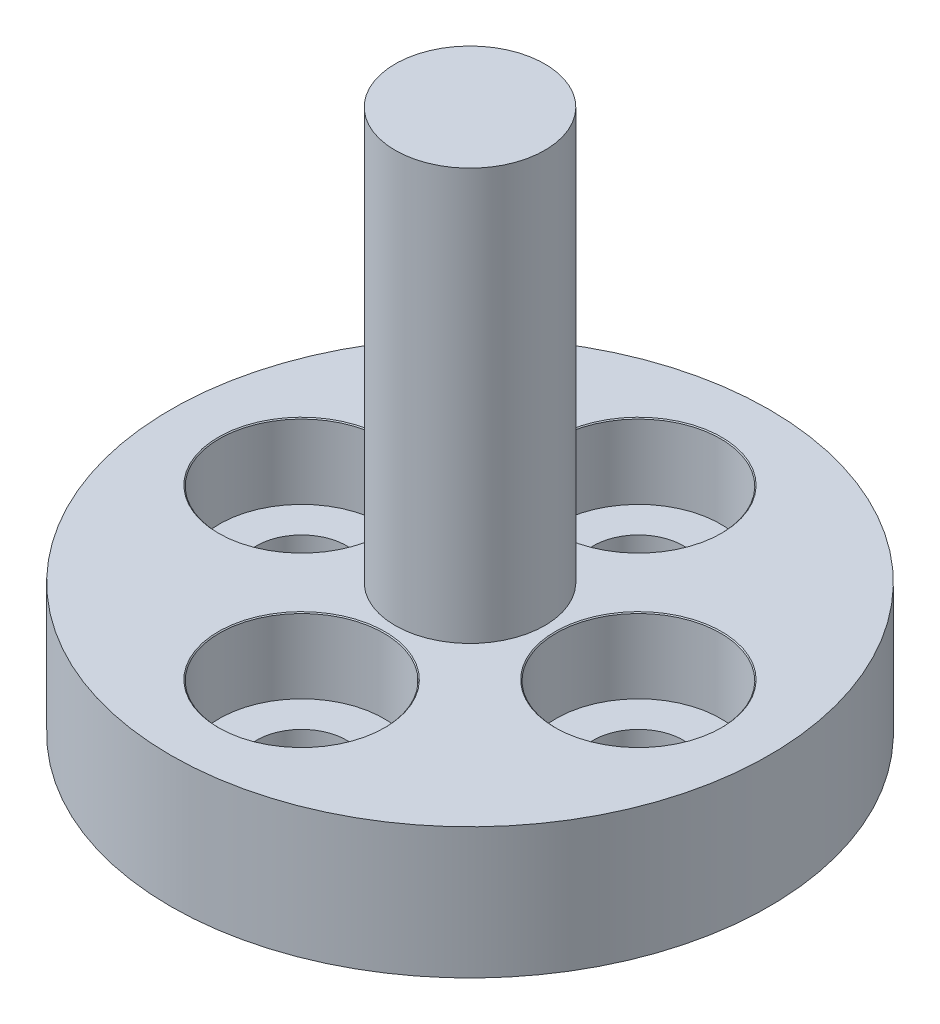
ISO-10303-21;
HEADER;
FILE_DESCRIPTION(('STEP AP214'),'2;1');
FILE_NAME('part.step','',(''),(''),'','','');
FILE_SCHEMA(('AUTOMOTIVE_DESIGN { 1 0 10303 214 1 1 1 1 }'));
ENDSEC;
DATA;
#1=APPLICATION_CONTEXT('core data for automotive mechanical design processes');
#2=APPLICATION_PROTOCOL_DEFINITION('international standard','automotive_design',2000,#1);
#3=PRODUCT_CONTEXT('',#1,'mechanical');
#4=PRODUCT('Part','Part','',(#3));
#5=PRODUCT_RELATED_PRODUCT_CATEGORY('part','',(#4));
#6=PRODUCT_DEFINITION_FORMATION('','',#4);
#7=PRODUCT_DEFINITION_CONTEXT('part definition',#1,'design');
#8=PRODUCT_DEFINITION('design','',#6,#7);
#9=PRODUCT_DEFINITION_SHAPE('','',#8);
#10=(LENGTH_UNIT() NAMED_UNIT(*) SI_UNIT(.MILLI.,.METRE.));
#11=(NAMED_UNIT(*) PLANE_ANGLE_UNIT() SI_UNIT($,.RADIAN.));
#12=(NAMED_UNIT(*) SI_UNIT($,.STERADIAN.) SOLID_ANGLE_UNIT());
#13=UNCERTAINTY_MEASURE_WITH_UNIT(LENGTH_MEASURE(1.E-05),#10,'distance_accuracy_value','');
#14=(GEOMETRIC_REPRESENTATION_CONTEXT(3) GLOBAL_UNCERTAINTY_ASSIGNED_CONTEXT((#13)) GLOBAL_UNIT_ASSIGNED_CONTEXT((#10,
#11,#12)) REPRESENTATION_CONTEXT('',''));
#15=CARTESIAN_POINT('',(0.,0.,0.));
#16=DIRECTION('',(0.,0.,1.));
#17=DIRECTION('',(1.,0.,0.));
#18=AXIS2_PLACEMENT_3D('',#15,#16,#17);
#19=CARTESIAN_POINT('',(0.,0.,0.));
#20=DIRECTION('',(0.,1.,0.));
#21=DIRECTION('',(0.,0.,1.));
#22=AXIS2_PLACEMENT_3D('',#19,#20,#21);
#23=PLANE('',#22);
#24=CARTESIAN_POINT('',(-4.5,0.,0.));
#25=DIRECTION('',(0.,1.,0.));
#26=DIRECTION('',(0.,0.,1.));
#27=AXIS2_PLACEMENT_3D('',#24,#25,#26);
#28=CIRCLE('',#27,1.2);
#29=CARTESIAN_POINT('',(-4.5,0.,1.2));
#30=VERTEX_POINT('',#29);
#31=EDGE_CURVE('E102',#30,#30,#28,.T.);
#32=ORIENTED_EDGE('',*,*,#31,.T.);
#33=EDGE_LOOP('',(#32));
#34=FACE_BOUND('',#33,.T.);
#35=CARTESIAN_POINT('',(0.,0.,-4.5));
#36=DIRECTION('',(0.,1.,0.));
#37=DIRECTION('',(0.,0.,1.));
#38=AXIS2_PLACEMENT_3D('',#35,#36,#37);
#39=CIRCLE('',#38,1.2);
#40=CARTESIAN_POINT('',(0.,0.,-3.3));
#41=VERTEX_POINT('',#40);
#42=EDGE_CURVE('E86',#41,#41,#39,.T.);
#43=ORIENTED_EDGE('',*,*,#42,.T.);
#44=EDGE_LOOP('',(#43));
#45=FACE_BOUND('',#44,.T.);
#46=CARTESIAN_POINT('',(4.5,0.,0.));
#47=DIRECTION('',(0.,1.,0.));
#48=DIRECTION('',(0.,0.,1.));
#49=AXIS2_PLACEMENT_3D('',#46,#47,#48);
#50=CIRCLE('',#49,1.2);
#51=CARTESIAN_POINT('',(4.5,0.,1.2));
#52=VERTEX_POINT('',#51);
#53=EDGE_CURVE('E73',#52,#52,#50,.T.);
#54=ORIENTED_EDGE('',*,*,#53,.T.);
#55=EDGE_LOOP('',(#54));
#56=FACE_BOUND('',#55,.T.);
#57=CARTESIAN_POINT('',(0.,0.,4.5));
#58=DIRECTION('',(0.,1.,0.));
#59=DIRECTION('',(0.,0.,1.));
#60=AXIS2_PLACEMENT_3D('',#57,#58,#59);
#61=CIRCLE('',#60,1.2);
#62=CARTESIAN_POINT('',(0.,0.,5.7));
#63=VERTEX_POINT('',#62);
#64=EDGE_CURVE('E57',#63,#63,#61,.T.);
#65=ORIENTED_EDGE('',*,*,#64,.T.);
#66=EDGE_LOOP('',(#65));
#67=FACE_BOUND('',#66,.T.);
#68=CARTESIAN_POINT('',(0.,0.,0.));
#69=DIRECTION('',(0.,1.,0.));
#70=DIRECTION('',(0.,0.,1.));
#71=AXIS2_PLACEMENT_3D('',#68,#69,#70);
#72=CIRCLE('',#71,8.);
#73=CARTESIAN_POINT('',(0.,0.,8.));
#74=VERTEX_POINT('',#73);
#75=EDGE_CURVE('E10',#74,#74,#72,.T.);
#76=ORIENTED_EDGE('',*,*,#75,.F.);
#77=EDGE_LOOP('',(#76));
#78=FACE_BOUND('',#77,.T.);
#79=ADVANCED_FACE('F40',(#34,#45,#56,#67,#78),#23,.F.);
#80=CARTESIAN_POINT('',(0.,14.5,0.));
#81=DIRECTION('',(0.,1.,0.));
#82=DIRECTION('',(0.,0.,1.));
#83=AXIS2_PLACEMENT_3D('',#80,#81,#82);
#84=CYLINDRICAL_SURFACE('',#83,8.);
#85=CARTESIAN_POINT('',(0.,3.5,0.));
#86=DIRECTION('',(0.,1.,0.));
#87=DIRECTION('',(0.,0.,1.));
#88=AXIS2_PLACEMENT_3D('',#85,#86,#87);
#89=CIRCLE('',#88,8.);
#90=CARTESIAN_POINT('',(0.,3.5,8.));
#91=VERTEX_POINT('',#90);
#92=EDGE_CURVE('E43',#91,#91,#89,.T.);
#93=ORIENTED_EDGE('',*,*,#92,.F.);
#94=EDGE_LOOP('',(#93));
#95=FACE_BOUND('',#94,.T.);
#96=ORIENTED_EDGE('',*,*,#75,.T.);
#97=EDGE_LOOP('',(#96));
#98=FACE_BOUND('',#97,.T.);
#99=ADVANCED_FACE('F121',(#95,#98),#84,.T.);
#100=CARTESIAN_POINT('',(8.,3.5,0.));
#101=DIRECTION('',(0.,-1.,0.));
#102=DIRECTION('',(0.,0.,-1.));
#103=AXIS2_PLACEMENT_3D('',#100,#101,#102);
#104=PLANE('',#103);
#105=CARTESIAN_POINT('',(-4.5,3.5,0.));
#106=DIRECTION('',(0.,1.,0.));
#107=DIRECTION('',(0.,0.,1.));
#108=AXIS2_PLACEMENT_3D('',#105,#106,#107);
#109=CIRCLE('',#108,2.225);
#110=CARTESIAN_POINT('',(-4.5,3.5,2.225));
#111=VERTEX_POINT('',#110);
#112=EDGE_CURVE('E111',#111,#111,#109,.T.);
#113=ORIENTED_EDGE('',*,*,#112,.F.);
#114=EDGE_LOOP('',(#113));
#115=FACE_BOUND('',#114,.T.);
#116=CARTESIAN_POINT('',(0.,3.5,-4.5));
#117=DIRECTION('',(0.,1.,0.));
#118=DIRECTION('',(0.,0.,1.));
#119=AXIS2_PLACEMENT_3D('',#116,#117,#118);
#120=CIRCLE('',#119,2.225);
#121=CARTESIAN_POINT('',(0.,3.5,-2.275));
#122=VERTEX_POINT('',#121);
#123=EDGE_CURVE('E97',#122,#122,#120,.T.);
#124=ORIENTED_EDGE('',*,*,#123,.F.);
#125=EDGE_LOOP('',(#124));
#126=FACE_BOUND('',#125,.T.);
#127=CARTESIAN_POINT('',(4.5,3.5,0.));
#128=DIRECTION('',(0.,1.,0.));
#129=DIRECTION('',(0.,0.,1.));
#130=AXIS2_PLACEMENT_3D('',#127,#128,#129);
#131=CIRCLE('',#130,2.225);
#132=CARTESIAN_POINT('',(4.5,3.5,2.225));
#133=VERTEX_POINT('',#132);
#134=EDGE_CURVE('E81',#133,#133,#131,.T.);
#135=ORIENTED_EDGE('',*,*,#134,.F.);
#136=EDGE_LOOP('',(#135));
#137=FACE_BOUND('',#136,.T.);
#138=CARTESIAN_POINT('',(0.,3.5,4.5));
#139=DIRECTION('',(0.,1.,0.));
#140=DIRECTION('',(0.,0.,1.));
#141=AXIS2_PLACEMENT_3D('',#138,#139,#140);
#142=CIRCLE('',#141,2.225);
#143=CARTESIAN_POINT('',(0.,3.5,6.725));
#144=VERTEX_POINT('',#143);
#145=EDGE_CURVE('E66',#144,#144,#142,.T.);
#146=ORIENTED_EDGE('',*,*,#145,.F.);
#147=EDGE_LOOP('',(#146));
#148=FACE_BOUND('',#147,.T.);
#149=CARTESIAN_POINT('',(0.,3.5,0.));
#150=DIRECTION('',(0.,1.,0.));
#151=DIRECTION('',(0.,0.,1.));
#152=AXIS2_PLACEMENT_3D('',#149,#150,#151);
#153=CIRCLE('',#152,2.);
#154=CARTESIAN_POINT('',(0.,3.5,2.));
#155=VERTEX_POINT('',#154);
#156=EDGE_CURVE('E50',#155,#155,#153,.T.);
#157=ORIENTED_EDGE('',*,*,#156,.F.);
#158=EDGE_LOOP('',(#157));
#159=FACE_BOUND('',#158,.T.);
#160=ORIENTED_EDGE('',*,*,#92,.T.);
#161=EDGE_LOOP('',(#160));
#162=FACE_BOUND('',#161,.T.);
#163=ADVANCED_FACE('F117',(#115,#126,#137,#148,#159,#162),#104,.F.);
#164=CARTESIAN_POINT('',(0.,14.5,0.));
#165=DIRECTION('',(0.,1.,0.));
#166=DIRECTION('',(0.,0.,1.));
#167=AXIS2_PLACEMENT_3D('',#164,#165,#166);
#168=CYLINDRICAL_SURFACE('',#167,2.);
#169=CARTESIAN_POINT('',(0.,14.5,0.));
#170=DIRECTION('',(0.,1.,0.));
#171=DIRECTION('',(0.,0.,1.));
#172=AXIS2_PLACEMENT_3D('',#169,#170,#171);
#173=CIRCLE('',#172,2.);
#174=CARTESIAN_POINT('',(0.,14.5,2.));
#175=VERTEX_POINT('',#174);
#176=EDGE_CURVE('E51',#175,#175,#173,.T.);
#177=ORIENTED_EDGE('',*,*,#176,.F.);
#178=EDGE_LOOP('',(#177));
#179=FACE_BOUND('',#178,.T.);
#180=ORIENTED_EDGE('',*,*,#156,.T.);
#181=EDGE_LOOP('',(#180));
#182=FACE_BOUND('',#181,.T.);
#183=ADVANCED_FACE('F122',(#179,#182),#168,.T.);
#184=CARTESIAN_POINT('',(2.,14.5,0.));
#185=DIRECTION('',(0.,-1.,0.));
#186=DIRECTION('',(0.,0.,-1.));
#187=AXIS2_PLACEMENT_3D('',#184,#185,#186);
#188=PLANE('',#187);
#189=ORIENTED_EDGE('',*,*,#176,.T.);
#190=EDGE_LOOP('',(#189));
#191=FACE_BOUND('',#190,.T.);
#192=ADVANCED_FACE('F132',(#191),#188,.F.);
#193=CARTESIAN_POINT('',(0.,3.5,4.5));
#194=DIRECTION('',(0.,1.,0.));
#195=DIRECTION('',(0.,0.,1.));
#196=AXIS2_PLACEMENT_3D('',#193,#194,#195);
#197=CYLINDRICAL_SURFACE('',#196,1.2);
#198=ORIENTED_EDGE('',*,*,#64,.F.);
#199=EDGE_LOOP('',(#198));
#200=FACE_BOUND('',#199,.T.);
#201=CARTESIAN_POINT('',(0.,1.5,4.5));
#202=DIRECTION('',(0.,1.,0.));
#203=DIRECTION('',(0.,0.,1.));
#204=AXIS2_PLACEMENT_3D('',#201,#202,#203);
#205=CIRCLE('',#204,1.2);
#206=CARTESIAN_POINT('',(0.,1.5,5.7));
#207=VERTEX_POINT('',#206);
#208=EDGE_CURVE('E56',#207,#207,#205,.T.);
#209=ORIENTED_EDGE('',*,*,#208,.T.);
#210=EDGE_LOOP('',(#209));
#211=FACE_BOUND('',#210,.T.);
#212=ADVANCED_FACE('F141',(#200,#211),#197,.F.);
#213=CARTESIAN_POINT('',(2.2,1.5,4.5));
#214=DIRECTION('',(0.,-1.,0.));
#215=DIRECTION('',(0.,0.,-1.));
#216=AXIS2_PLACEMENT_3D('',#213,#214,#215);
#217=PLANE('',#216);
#218=ORIENTED_EDGE('',*,*,#208,.F.);
#219=EDGE_LOOP('',(#218));
#220=FACE_BOUND('',#219,.T.);
#221=CARTESIAN_POINT('',(0.,1.5,4.5));
#222=DIRECTION('',(0.,1.,0.));
#223=DIRECTION('',(0.,0.,1.));
#224=AXIS2_PLACEMENT_3D('',#221,#222,#223);
#225=CIRCLE('',#224,2.2);
#226=CARTESIAN_POINT('',(0.,1.5,6.7));
#227=VERTEX_POINT('',#226);
#228=EDGE_CURVE('E65',#227,#227,#225,.T.);
#229=ORIENTED_EDGE('',*,*,#228,.T.);
#230=EDGE_LOOP('',(#229));
#231=FACE_BOUND('',#230,.T.);
#232=ADVANCED_FACE('F163',(#220,#231),#217,.F.);
#233=CARTESIAN_POINT('',(0.,3.5,4.5));
#234=DIRECTION('',(0.,1.,0.));
#235=DIRECTION('',(0.,0.,1.));
#236=AXIS2_PLACEMENT_3D('',#233,#234,#235);
#237=CYLINDRICAL_SURFACE('',#236,2.2);
#238=ORIENTED_EDGE('',*,*,#228,.F.);
#239=EDGE_LOOP('',(#238));
#240=FACE_BOUND('',#239,.T.);
#241=CARTESIAN_POINT('',(0.,3.475,4.5));
#242=DIRECTION('',(0.,1.,0.));
#243=DIRECTION('',(0.,0.,1.));
#244=AXIS2_PLACEMENT_3D('',#241,#242,#243);
#245=CIRCLE('',#244,2.2);
#246=CARTESIAN_POINT('',(0.,3.475,6.7));
#247=VERTEX_POINT('',#246);
#248=EDGE_CURVE('E64',#247,#247,#245,.T.);
#249=ORIENTED_EDGE('',*,*,#248,.T.);
#250=EDGE_LOOP('',(#249));
#251=FACE_BOUND('',#250,.T.);
#252=ADVANCED_FACE('F167',(#240,#251),#237,.F.);
#253=CARTESIAN_POINT('',(0.,3.5,4.5));
#254=DIRECTION('',(0.,1.,0.));
#255=DIRECTION('',(0.,0.,1.));
#256=AXIS2_PLACEMENT_3D('',#253,#254,#255);
#257=CONICAL_SURFACE('',#256,2.225,0.785398163397457);
#258=ORIENTED_EDGE('',*,*,#248,.F.);
#259=EDGE_LOOP('',(#258));
#260=FACE_BOUND('',#259,.T.);
#261=ORIENTED_EDGE('',*,*,#145,.T.);
#262=EDGE_LOOP('',(#261));
#263=FACE_BOUND('',#262,.T.);
#264=ADVANCED_FACE('F171',(#260,#263),#257,.F.);
#265=CARTESIAN_POINT('',(4.5,3.5,0.));
#266=DIRECTION('',(0.,1.,0.));
#267=DIRECTION('',(0.,0.,1.));
#268=AXIS2_PLACEMENT_3D('',#265,#266,#267);
#269=CYLINDRICAL_SURFACE('',#268,1.2);
#270=ORIENTED_EDGE('',*,*,#53,.F.);
#271=EDGE_LOOP('',(#270));
#272=FACE_BOUND('',#271,.T.);
#273=CARTESIAN_POINT('',(4.5,1.5,0.));
#274=DIRECTION('',(0.,1.,0.));
#275=DIRECTION('',(0.,0.,1.));
#276=AXIS2_PLACEMENT_3D('',#273,#274,#275);
#277=CIRCLE('',#276,1.2);
#278=CARTESIAN_POINT('',(4.5,1.5,1.2));
#279=VERTEX_POINT('',#278);
#280=EDGE_CURVE('E72',#279,#279,#277,.T.);
#281=ORIENTED_EDGE('',*,*,#280,.T.);
#282=EDGE_LOOP('',(#281));
#283=FACE_BOUND('',#282,.T.);
#284=ADVANCED_FACE('F177',(#272,#283),#269,.F.);
#285=CARTESIAN_POINT('',(6.7,1.5,0.));
#286=DIRECTION('',(0.,-1.,0.));
#287=DIRECTION('',(0.,0.,-1.));
#288=AXIS2_PLACEMENT_3D('',#285,#286,#287);
#289=PLANE('',#288);
#290=ORIENTED_EDGE('',*,*,#280,.F.);
#291=EDGE_LOOP('',(#290));
#292=FACE_BOUND('',#291,.T.);
#293=CARTESIAN_POINT('',(4.5,1.5,0.));
#294=DIRECTION('',(0.,1.,0.));
#295=DIRECTION('',(0.,0.,1.));
#296=AXIS2_PLACEMENT_3D('',#293,#294,#295);
#297=CIRCLE('',#296,2.2);
#298=CARTESIAN_POINT('',(4.5,1.5,2.2));
#299=VERTEX_POINT('',#298);
#300=EDGE_CURVE('E77',#299,#299,#297,.T.);
#301=ORIENTED_EDGE('',*,*,#300,.T.);
#302=EDGE_LOOP('',(#301));
#303=FACE_BOUND('',#302,.T.);
#304=ADVANCED_FACE('F182',(#292,#303),#289,.F.);
#305=CARTESIAN_POINT('',(4.5,3.5,0.));
#306=DIRECTION('',(0.,1.,0.));
#307=DIRECTION('',(0.,0.,1.));
#308=AXIS2_PLACEMENT_3D('',#305,#306,#307);
#309=CYLINDRICAL_SURFACE('',#308,2.2);
#310=ORIENTED_EDGE('',*,*,#300,.F.);
#311=EDGE_LOOP('',(#310));
#312=FACE_BOUND('',#311,.T.);
#313=CARTESIAN_POINT('',(4.5,3.475,0.));
#314=DIRECTION('',(0.,1.,0.));
#315=DIRECTION('',(0.,0.,1.));
#316=AXIS2_PLACEMENT_3D('',#313,#314,#315);
#317=CIRCLE('',#316,2.2);
#318=CARTESIAN_POINT('',(4.5,3.475,2.2));
#319=VERTEX_POINT('',#318);
#320=EDGE_CURVE('E79',#319,#319,#317,.T.);
#321=ORIENTED_EDGE('',*,*,#320,.T.);
#322=EDGE_LOOP('',(#321));
#323=FACE_BOUND('',#322,.T.);
#324=ADVANCED_FACE('F189',(#312,#323),#309,.F.);
#325=CARTESIAN_POINT('',(4.5,3.5,0.));
#326=DIRECTION('',(0.,1.,0.));
#327=DIRECTION('',(0.,0.,1.));
#328=AXIS2_PLACEMENT_3D('',#325,#326,#327);
#329=CONICAL_SURFACE('',#328,2.225,0.785398163397466);
#330=ORIENTED_EDGE('',*,*,#320,.F.);
#331=EDGE_LOOP('',(#330));
#332=FACE_BOUND('',#331,.T.);
#333=ORIENTED_EDGE('',*,*,#134,.T.);
#334=EDGE_LOOP('',(#333));
#335=FACE_BOUND('',#334,.T.);
#336=ADVANCED_FACE('F191',(#332,#335),#329,.F.);
#337=CARTESIAN_POINT('',(0.,3.5,-4.5));
#338=DIRECTION('',(0.,1.,0.));
#339=DIRECTION('',(0.,0.,1.));
#340=AXIS2_PLACEMENT_3D('',#337,#338,#339);
#341=CYLINDRICAL_SURFACE('',#340,1.2);
#342=ORIENTED_EDGE('',*,*,#42,.F.);
#343=EDGE_LOOP('',(#342));
#344=FACE_BOUND('',#343,.T.);
#345=CARTESIAN_POINT('',(0.,1.5,-4.5));
#346=DIRECTION('',(0.,1.,0.));
#347=DIRECTION('',(0.,0.,1.));
#348=AXIS2_PLACEMENT_3D('',#345,#346,#347);
#349=CIRCLE('',#348,1.2);
#350=CARTESIAN_POINT('',(0.,1.5,-3.3));
#351=VERTEX_POINT('',#350);
#352=EDGE_CURVE('E87',#351,#351,#349,.T.);
#353=ORIENTED_EDGE('',*,*,#352,.T.);
#354=EDGE_LOOP('',(#353));
#355=FACE_BOUND('',#354,.T.);
#356=ADVANCED_FACE('F196',(#344,#355),#341,.F.);
#357=CARTESIAN_POINT('',(2.2,1.5,-4.5));
#358=DIRECTION('',(0.,-1.,0.));
#359=DIRECTION('',(0.,0.,-1.));
#360=AXIS2_PLACEMENT_3D('',#357,#358,#359);
#361=PLANE('',#360);
#362=ORIENTED_EDGE('',*,*,#352,.F.);
#363=EDGE_LOOP('',(#362));
#364=FACE_BOUND('',#363,.T.);
#365=CARTESIAN_POINT('',(0.,1.5,-4.5));
#366=DIRECTION('',(0.,1.,0.));
#367=DIRECTION('',(0.,0.,1.));
#368=AXIS2_PLACEMENT_3D('',#365,#366,#367);
#369=CIRCLE('',#368,2.2);
#370=CARTESIAN_POINT('',(0.,1.5,-2.3));
#371=VERTEX_POINT('',#370);
#372=EDGE_CURVE('E95',#371,#371,#369,.T.);
#373=ORIENTED_EDGE('',*,*,#372,.T.);
#374=EDGE_LOOP('',(#373));
#375=FACE_BOUND('',#374,.T.);
#376=ADVANCED_FACE('F205',(#364,#375),#361,.F.);
#377=CARTESIAN_POINT('',(0.,3.5,-4.5));
#378=DIRECTION('',(0.,1.,0.));
#379=DIRECTION('',(0.,0.,1.));
#380=AXIS2_PLACEMENT_3D('',#377,#378,#379);
#381=CYLINDRICAL_SURFACE('',#380,2.2);
#382=ORIENTED_EDGE('',*,*,#372,.F.);
#383=EDGE_LOOP('',(#382));
#384=FACE_BOUND('',#383,.T.);
#385=CARTESIAN_POINT('',(0.,3.475,-4.5));
#386=DIRECTION('',(0.,1.,0.));
#387=DIRECTION('',(0.,0.,1.));
#388=AXIS2_PLACEMENT_3D('',#385,#386,#387);
#389=CIRCLE('',#388,2.2);
#390=CARTESIAN_POINT('',(0.,3.475,-2.3));
#391=VERTEX_POINT('',#390);
#392=EDGE_CURVE('E94',#391,#391,#389,.T.);
#393=ORIENTED_EDGE('',*,*,#392,.T.);
#394=EDGE_LOOP('',(#393));
#395=FACE_BOUND('',#394,.T.);
#396=ADVANCED_FACE('F208',(#384,#395),#381,.F.);
#397=CARTESIAN_POINT('',(0.,3.5,-4.5));
#398=DIRECTION('',(0.,1.,0.));
#399=DIRECTION('',(0.,0.,1.));
#400=AXIS2_PLACEMENT_3D('',#397,#398,#399);
#401=CONICAL_SURFACE('',#400,2.225,0.785398163397457);
#402=ORIENTED_EDGE('',*,*,#392,.F.);
#403=EDGE_LOOP('',(#402));
#404=FACE_BOUND('',#403,.T.);
#405=ORIENTED_EDGE('',*,*,#123,.T.);
#406=EDGE_LOOP('',(#405));
#407=FACE_BOUND('',#406,.T.);
#408=ADVANCED_FACE('F209',(#404,#407),#401,.F.);
#409=CARTESIAN_POINT('',(-4.5,3.5,0.));
#410=DIRECTION('',(0.,1.,0.));
#411=DIRECTION('',(0.,0.,1.));
#412=AXIS2_PLACEMENT_3D('',#409,#410,#411);
#413=CYLINDRICAL_SURFACE('',#412,1.2);
#414=ORIENTED_EDGE('',*,*,#31,.F.);
#415=EDGE_LOOP('',(#414));
#416=FACE_BOUND('',#415,.T.);
#417=CARTESIAN_POINT('',(-4.5,1.5,0.));
#418=DIRECTION('',(0.,1.,0.));
#419=DIRECTION('',(0.,0.,1.));
#420=AXIS2_PLACEMENT_3D('',#417,#418,#419);
#421=CIRCLE('',#420,1.2);
#422=CARTESIAN_POINT('',(-4.5,1.5,1.2));
#423=VERTEX_POINT('',#422);
#424=EDGE_CURVE('E101',#423,#423,#421,.T.);
#425=ORIENTED_EDGE('',*,*,#424,.T.);
#426=EDGE_LOOP('',(#425));
#427=FACE_BOUND('',#426,.T.);
#428=ADVANCED_FACE('F215',(#416,#427),#413,.F.);
#429=CARTESIAN_POINT('',(-2.3,1.5,0.));
#430=DIRECTION('',(0.,-1.,0.));
#431=DIRECTION('',(0.,0.,-1.));
#432=AXIS2_PLACEMENT_3D('',#429,#430,#431);
#433=PLANE('',#432);
#434=ORIENTED_EDGE('',*,*,#424,.F.);
#435=EDGE_LOOP('',(#434));
#436=FACE_BOUND('',#435,.T.);
#437=CARTESIAN_POINT('',(-4.5,1.5,0.));
#438=DIRECTION('',(0.,1.,0.));
#439=DIRECTION('',(0.,0.,1.));
#440=AXIS2_PLACEMENT_3D('',#437,#438,#439);
#441=CIRCLE('',#440,2.2);
#442=CARTESIAN_POINT('',(-4.5,1.5,2.2));
#443=VERTEX_POINT('',#442);
#444=EDGE_CURVE('E110',#443,#443,#441,.T.);
#445=ORIENTED_EDGE('',*,*,#444,.T.);
#446=EDGE_LOOP('',(#445));
#447=FACE_BOUND('',#446,.T.);
#448=ADVANCED_FACE('F216',(#436,#447),#433,.F.);
#449=CARTESIAN_POINT('',(-4.5,3.5,0.));
#450=DIRECTION('',(0.,1.,0.));
#451=DIRECTION('',(0.,0.,1.));
#452=AXIS2_PLACEMENT_3D('',#449,#450,#451);
#453=CYLINDRICAL_SURFACE('',#452,2.2);
#454=ORIENTED_EDGE('',*,*,#444,.F.);
#455=EDGE_LOOP('',(#454));
#456=FACE_BOUND('',#455,.T.);
#457=CARTESIAN_POINT('',(-4.5,3.475,0.));
#458=DIRECTION('',(0.,1.,0.));
#459=DIRECTION('',(0.,0.,1.));
#460=AXIS2_PLACEMENT_3D('',#457,#458,#459);
#461=CIRCLE('',#460,2.2);
#462=CARTESIAN_POINT('',(-4.5,3.475,2.2));
#463=VERTEX_POINT('',#462);
#464=EDGE_CURVE('E109',#463,#463,#461,.T.);
#465=ORIENTED_EDGE('',*,*,#464,.T.);
#466=EDGE_LOOP('',(#465));
#467=FACE_BOUND('',#466,.T.);
#468=ADVANCED_FACE('F225',(#456,#467),#453,.F.);
#469=CARTESIAN_POINT('',(-4.5,3.5,0.));
#470=DIRECTION('',(0.,1.,0.));
#471=DIRECTION('',(0.,0.,1.));
#472=AXIS2_PLACEMENT_3D('',#469,#470,#471);
#473=CONICAL_SURFACE('',#472,2.225,0.785398163397457);
#474=ORIENTED_EDGE('',*,*,#464,.F.);
#475=EDGE_LOOP('',(#474));
#476=FACE_BOUND('',#475,.T.);
#477=ORIENTED_EDGE('',*,*,#112,.T.);
#478=EDGE_LOOP('',(#477));
#479=FACE_BOUND('',#478,.T.);
#480=ADVANCED_FACE('F120',(#476,#479),#473,.F.);
#481=CLOSED_SHELL('',(#79,#99,#163,#183,#192,#212,#232,#252,#264,#284,#304,#324,#336,#356,#376,
#396,#408,#428,#448,#468,#480));
#482=MANIFOLD_SOLID_BREP('B2',#481);
#483=ADVANCED_BREP_SHAPE_REPRESENTATION('',(#18,#482),#14);
#484=SHAPE_DEFINITION_REPRESENTATION(#9,#483);
ENDSEC;
END-ISO-10303-21;
